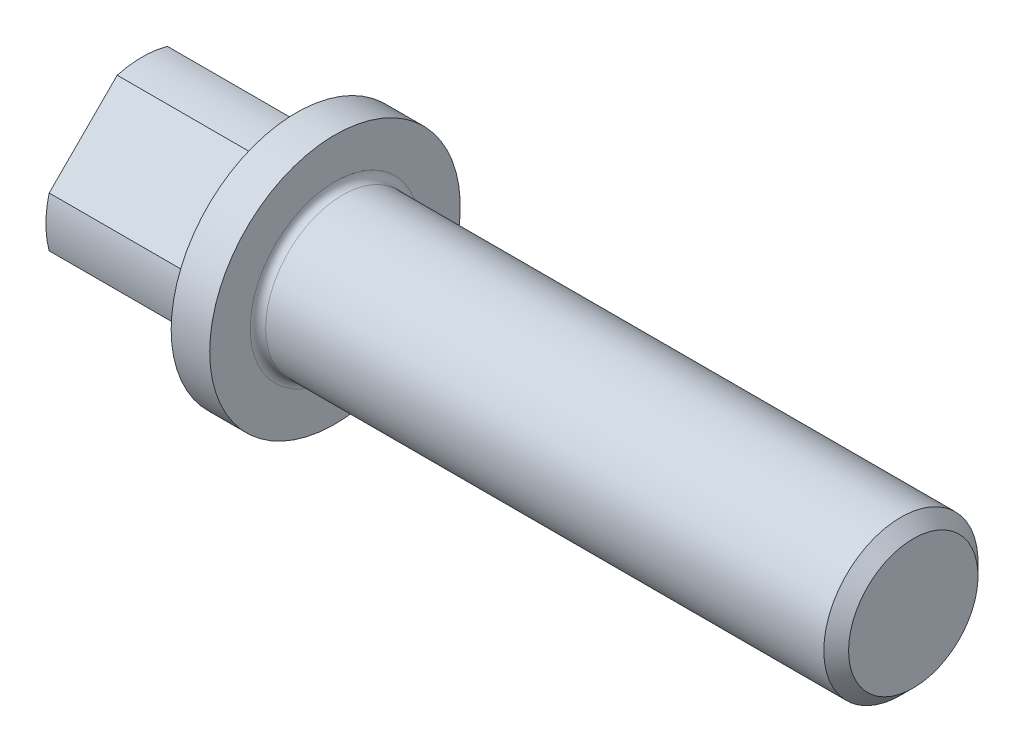
ISO-10303-21;
HEADER;
FILE_DESCRIPTION(('STEP AP214'),'2;1');
FILE_NAME('part.step','',(''),(''),'','','');
FILE_SCHEMA(('AUTOMOTIVE_DESIGN { 1 0 10303 214 1 1 1 1 }'));
ENDSEC;
DATA;
#1=APPLICATION_CONTEXT('core data for automotive mechanical design processes');
#2=APPLICATION_PROTOCOL_DEFINITION('international standard','automotive_design',2000,#1);
#3=PRODUCT_CONTEXT('',#1,'mechanical');
#4=PRODUCT('Part','Part','',(#3));
#5=PRODUCT_RELATED_PRODUCT_CATEGORY('part','',(#4));
#6=PRODUCT_DEFINITION_FORMATION('','',#4);
#7=PRODUCT_DEFINITION_CONTEXT('part definition',#1,'design');
#8=PRODUCT_DEFINITION('design','',#6,#7);
#9=PRODUCT_DEFINITION_SHAPE('','',#8);
#10=(LENGTH_UNIT() NAMED_UNIT(*) SI_UNIT(.MILLI.,.METRE.));
#11=(NAMED_UNIT(*) PLANE_ANGLE_UNIT() SI_UNIT($,.RADIAN.));
#12=(NAMED_UNIT(*) SI_UNIT($,.STERADIAN.) SOLID_ANGLE_UNIT());
#13=UNCERTAINTY_MEASURE_WITH_UNIT(LENGTH_MEASURE(1.E-05),#10,'distance_accuracy_value','');
#14=(GEOMETRIC_REPRESENTATION_CONTEXT(3) GLOBAL_UNCERTAINTY_ASSIGNED_CONTEXT((#13)) GLOBAL_UNIT_ASSIGNED_CONTEXT((#10,
#11,#12)) REPRESENTATION_CONTEXT('',''));
#15=CARTESIAN_POINT('',(0.,0.,0.));
#16=DIRECTION('',(0.,0.,1.));
#17=DIRECTION('',(1.,0.,0.));
#18=AXIS2_PLACEMENT_3D('',#15,#16,#17);
#19=CARTESIAN_POINT('',(60.,5.036,0.));
#20=DIRECTION('',(1.,0.,0.));
#21=DIRECTION('',(0.,0.,-1.));
#22=AXIS2_PLACEMENT_3D('',#19,#20,#21);
#23=PLANE('',#22);
#24=CARTESIAN_POINT('',(60.,0.,0.));
#25=DIRECTION('',(-1.,0.,0.));
#26=DIRECTION('',(0.,0.,1.));
#27=AXIS2_PLACEMENT_3D('',#24,#25,#26);
#28=CIRCLE('',#27,5.036);
#29=CARTESIAN_POINT('',(60.,0.,5.036));
#30=VERTEX_POINT('',#29);
#31=EDGE_CURVE('E170',#30,#30,#28,.T.);
#32=ORIENTED_EDGE('',*,*,#31,.F.);
#33=EDGE_LOOP('',(#32));
#34=FACE_BOUND('',#33,.T.);
#35=ADVANCED_FACE('F33',(#34),#23,.T.);
#36=CARTESIAN_POINT('',(60.,0.,0.));
#37=DIRECTION('',(-1.,0.,0.));
#38=DIRECTION('',(0.,0.,1.));
#39=AXIS2_PLACEMENT_3D('',#36,#37,#38);
#40=CONICAL_SURFACE('',#39,5.036,0.785398163397445);
#41=CARTESIAN_POINT('',(59.036,0.,0.));
#42=DIRECTION('',(-1.,0.,0.));
#43=DIRECTION('',(0.,0.,1.));
#44=AXIS2_PLACEMENT_3D('',#41,#42,#43);
#45=CIRCLE('',#44,6.);
#46=CARTESIAN_POINT('',(59.036,0.,6.));
#47=VERTEX_POINT('',#46);
#48=EDGE_CURVE('E167',#47,#47,#45,.T.);
#49=ORIENTED_EDGE('',*,*,#48,.F.);
#50=EDGE_LOOP('',(#49));
#51=FACE_BOUND('',#50,.T.);
#52=ORIENTED_EDGE('',*,*,#31,.T.);
#53=EDGE_LOOP('',(#52));
#54=FACE_BOUND('',#53,.T.);
#55=ADVANCED_FACE('F192',(#51,#54),#40,.T.);
#56=CARTESIAN_POINT('',(-31.75,0.,0.));
#57=DIRECTION('',(-1.,0.,0.));
#58=DIRECTION('',(0.,0.,1.));
#59=AXIS2_PLACEMENT_3D('',#56,#57,#58);
#60=CYLINDRICAL_SURFACE('',#59,6.);
#61=CARTESIAN_POINT('',(15.6,0.,0.));
#62=DIRECTION('',(1.,0.,0.));
#63=DIRECTION('',(0.,0.,-1.));
#64=AXIS2_PLACEMENT_3D('',#61,#62,#63);
#65=CIRCLE('',#64,6.);
#66=CARTESIAN_POINT('',(15.6,0.,-6.));
#67=VERTEX_POINT('',#66);
#68=EDGE_CURVE('E12',#67,#67,#65,.T.);
#69=ORIENTED_EDGE('',*,*,#68,.T.);
#70=EDGE_LOOP('',(#69));
#71=FACE_BOUND('',#70,.T.);
#72=ORIENTED_EDGE('',*,*,#48,.T.);
#73=EDGE_LOOP('',(#72));
#74=FACE_BOUND('',#73,.T.);
#75=ADVANCED_FACE('F197',(#71,#74),#60,.T.);
#76=CARTESIAN_POINT('',(15.,9.75,0.));
#77=DIRECTION('',(1.,0.,0.));
#78=DIRECTION('',(0.,0.,-1.));
#79=AXIS2_PLACEMENT_3D('',#76,#77,#78);
#80=PLANE('',#79);
#81=CARTESIAN_POINT('',(15.,0.,0.));
#82=DIRECTION('',(1.,0.,0.));
#83=DIRECTION('',(0.,0.,-1.));
#84=AXIS2_PLACEMENT_3D('',#81,#82,#83);
#85=CIRCLE('',#84,6.6);
#86=CARTESIAN_POINT('',(15.,0.,-6.6));
#87=VERTEX_POINT('',#86);
#88=EDGE_CURVE('E42',#87,#87,#85,.F.);
#89=ORIENTED_EDGE('',*,*,#88,.T.);
#90=EDGE_LOOP('',(#89));
#91=FACE_BOUND('',#90,.T.);
#92=CARTESIAN_POINT('',(15.,0.,0.));
#93=DIRECTION('',(-1.,0.,0.));
#94=DIRECTION('',(0.,0.,1.));
#95=AXIS2_PLACEMENT_3D('',#92,#93,#94);
#96=CIRCLE('',#95,9.75);
#97=CARTESIAN_POINT('',(15.,0.,9.75));
#98=VERTEX_POINT('',#97);
#99=EDGE_CURVE('E164',#98,#98,#96,.T.);
#100=ORIENTED_EDGE('',*,*,#99,.F.);
#101=EDGE_LOOP('',(#100));
#102=FACE_BOUND('',#101,.T.);
#103=ADVANCED_FACE('F176',(#91,#102),#80,.T.);
#104=CARTESIAN_POINT('',(-31.75,0.,0.));
#105=DIRECTION('',(-1.,0.,0.));
#106=DIRECTION('',(0.,0.,1.));
#107=AXIS2_PLACEMENT_3D('',#104,#105,#106);
#108=CYLINDRICAL_SURFACE('',#107,9.75);
#109=CARTESIAN_POINT('',(12.,0.,0.));
#110=DIRECTION('',(1.,0.,0.));
#111=DIRECTION('',(0.,0.,-1.));
#112=AXIS2_PLACEMENT_3D('',#109,#110,#111);
#113=CIRCLE('',#112,9.75);
#114=CARTESIAN_POINT('',(12.,0.,-9.75));
#115=VERTEX_POINT('',#114);
#116=EDGE_CURVE('E37',#115,#115,#113,.F.);
#117=ORIENTED_EDGE('',*,*,#116,.F.);
#118=EDGE_LOOP('',(#117));
#119=FACE_BOUND('',#118,.T.);
#120=ORIENTED_EDGE('',*,*,#99,.T.);
#121=EDGE_LOOP('',(#120));
#122=FACE_BOUND('',#121,.T.);
#123=ADVANCED_FACE('F180',(#119,#122),#108,.T.);
#124=CARTESIAN_POINT('',(15.6,0.,0.));
#125=DIRECTION('',(1.,0.,0.));
#126=DIRECTION('',(0.,0.,-1.));
#127=AXIS2_PLACEMENT_3D('',#124,#125,#126);
#128=TOROIDAL_SURFACE('',#127,6.6,0.6);
#129=ORIENTED_EDGE('',*,*,#68,.F.);
#130=EDGE_LOOP('',(#129));
#131=FACE_BOUND('',#130,.T.);
#132=ORIENTED_EDGE('',*,*,#88,.F.);
#133=EDGE_LOOP('',(#132));
#134=FACE_BOUND('',#133,.T.);
#135=ADVANCED_FACE('F35',(#131,#134),#128,.F.);
#136=CARTESIAN_POINT('',(12.,0.,0.));
#137=DIRECTION('',(1.,0.,0.));
#138=DIRECTION('',(0.,0.,-1.));
#139=AXIS2_PLACEMENT_3D('',#136,#137,#138);
#140=PLANE('',#139);
#141=ORIENTED_EDGE('',*,*,#116,.T.);
#142=EDGE_LOOP('',(#141));
#143=FACE_BOUND('',#142,.T.);
#144=DIRECTION('',(0.,-0.707106781186547,-0.707106781186547));
#145=VECTOR('',#144,1.);
#146=CARTESIAN_POINT('',(12.,-7.24194538877715,1.95044276664797));
#147=LINE('',#146,#145);
#148=CARTESIAN_POINT('',(12.,-1.95044276664797,7.24194538877715));
#149=VERTEX_POINT('',#148);
#150=CARTESIAN_POINT('',(12.,-7.24194538877715,1.95044276664797));
#151=VERTEX_POINT('',#150);
#152=EDGE_CURVE('E101',#149,#151,#147,.T.);
#153=ORIENTED_EDGE('',*,*,#152,.T.);
#154=CARTESIAN_POINT('',(12.,0.,0.));
#155=DIRECTION('',(1.,0.,0.));
#156=DIRECTION('',(0.,0.,-1.));
#157=AXIS2_PLACEMENT_3D('',#154,#155,#156);
#158=CIRCLE('',#157,7.5);
#159=CARTESIAN_POINT('',(12.,-7.24194538877715,-1.95044276664797));
#160=VERTEX_POINT('',#159);
#161=EDGE_CURVE('E121',#151,#160,#158,.T.);
#162=ORIENTED_EDGE('',*,*,#161,.T.);
#163=DIRECTION('',(0.,0.707106781186547,-0.707106781186547));
#164=VECTOR('',#163,1.);
#165=CARTESIAN_POINT('',(12.,-7.24194538877715,-1.95044276664797));
#166=LINE('',#165,#164);
#167=CARTESIAN_POINT('',(12.,-1.95044276664797,-7.24194538877715));
#168=VERTEX_POINT('',#167);
#169=EDGE_CURVE('E123',#160,#168,#166,.T.);
#170=ORIENTED_EDGE('',*,*,#169,.T.);
#171=CARTESIAN_POINT('',(12.,0.,0.));
#172=DIRECTION('',(1.,0.,0.));
#173=DIRECTION('',(0.,0.,-1.));
#174=AXIS2_PLACEMENT_3D('',#171,#172,#173);
#175=CIRCLE('',#174,7.5);
#176=CARTESIAN_POINT('',(12.,1.95044276664797,-7.24194538877715));
#177=VERTEX_POINT('',#176);
#178=EDGE_CURVE('E127',#168,#177,#175,.T.);
#179=ORIENTED_EDGE('',*,*,#178,.T.);
#180=DIRECTION('',(0.,0.707106781186548,0.707106781186547));
#181=VECTOR('',#180,1.);
#182=CARTESIAN_POINT('',(12.,1.95044276664797,-7.24194538877715));
#183=LINE('',#182,#181);
#184=CARTESIAN_POINT('',(12.,7.24194538877715,-1.95044276664797));
#185=VERTEX_POINT('',#184);
#186=EDGE_CURVE('E129',#177,#185,#183,.T.);
#187=ORIENTED_EDGE('',*,*,#186,.T.);
#188=CARTESIAN_POINT('',(12.,0.,0.));
#189=DIRECTION('',(1.,0.,0.));
#190=DIRECTION('',(0.,0.,-1.));
#191=AXIS2_PLACEMENT_3D('',#188,#189,#190);
#192=CIRCLE('',#191,7.5);
#193=CARTESIAN_POINT('',(12.,7.24194538877715,1.95044276664797));
#194=VERTEX_POINT('',#193);
#195=EDGE_CURVE('E131',#185,#194,#192,.T.);
#196=ORIENTED_EDGE('',*,*,#195,.T.);
#197=DIRECTION('',(0.,-0.707106781186547,0.707106781186548));
#198=VECTOR('',#197,1.);
#199=CARTESIAN_POINT('',(12.,1.95044276664797,7.24194538877715));
#200=LINE('',#199,#198);
#201=CARTESIAN_POINT('',(12.,1.95044276664797,7.24194538877715));
#202=VERTEX_POINT('',#201);
#203=EDGE_CURVE('E104',#194,#202,#200,.T.);
#204=ORIENTED_EDGE('',*,*,#203,.T.);
#205=CARTESIAN_POINT('',(12.,0.,0.));
#206=DIRECTION('',(1.,0.,0.));
#207=DIRECTION('',(0.,0.,-1.));
#208=AXIS2_PLACEMENT_3D('',#205,#206,#207);
#209=CIRCLE('',#208,7.5);
#210=EDGE_CURVE('E97',#202,#149,#209,.T.);
#211=ORIENTED_EDGE('',*,*,#210,.T.);
#212=EDGE_LOOP('',(#153,#162,#170,#179,#187,#196,#204,#211));
#213=FACE_BOUND('',#212,.T.);
#214=ADVANCED_FACE('F99',(#143,#213),#140,.F.);
#215=CARTESIAN_POINT('',(12.,0.,0.));
#216=DIRECTION('',(-1.,0.,0.));
#217=DIRECTION('',(0.,0.,1.));
#218=AXIS2_PLACEMENT_3D('',#215,#216,#217);
#219=CYLINDRICAL_SURFACE('',#218,7.5);
#220=CARTESIAN_POINT('',(0.,0.,0.));
#221=DIRECTION('',(1.,0.,0.));
#222=DIRECTION('',(0.,0.,-1.));
#223=AXIS2_PLACEMENT_3D('',#220,#221,#222);
#224=CIRCLE('',#223,7.5);
#225=CARTESIAN_POINT('',(0.,1.95044276664797,7.24194538877715));
#226=VERTEX_POINT('',#225);
#227=CARTESIAN_POINT('',(0.,-1.95044276664797,7.24194538877715));
#228=VERTEX_POINT('',#227);
#229=EDGE_CURVE('E113',#226,#228,#224,.T.);
#230=ORIENTED_EDGE('',*,*,#229,.T.);
#231=DIRECTION('',(-1.,0.,0.));
#232=VECTOR('',#231,1.);
#233=CARTESIAN_POINT('',(12.,-1.95044276664797,7.24194538877715));
#234=LINE('',#233,#232);
#235=EDGE_CURVE('E110',#149,#228,#234,.T.);
#236=ORIENTED_EDGE('',*,*,#235,.F.);
#237=ORIENTED_EDGE('',*,*,#210,.F.);
#238=DIRECTION('',(-1.,0.,0.));
#239=VECTOR('',#238,1.);
#240=CARTESIAN_POINT('',(12.,1.95044276664797,7.24194538877715));
#241=LINE('',#240,#239);
#242=EDGE_CURVE('E134',#202,#226,#241,.T.);
#243=ORIENTED_EDGE('',*,*,#242,.T.);
#244=EDGE_LOOP('',(#230,#236,#237,#243));
#245=FACE_BOUND('',#244,.T.);
#246=ADVANCED_FACE('F111',(#245),#219,.T.);
#247=CARTESIAN_POINT('',(12.,-7.24194538877715,1.95044276664797));
#248=DIRECTION('',(0.,0.707106781186548,-0.707106781186548));
#249=DIRECTION('',(0.,0.707106781186548,0.707106781186548));
#250=AXIS2_PLACEMENT_3D('',#247,#248,#249);
#251=PLANE('',#250);
#252=DIRECTION('',(0.,-0.707106781186547,-0.707106781186547));
#253=VECTOR('',#252,1.);
#254=CARTESIAN_POINT('',(0.,-7.24194538877715,1.95044276664797));
#255=LINE('',#254,#253);
#256=CARTESIAN_POINT('',(0.,-7.24194538877715,1.95044276664797));
#257=VERTEX_POINT('',#256);
#258=EDGE_CURVE('E136',#228,#257,#255,.T.);
#259=ORIENTED_EDGE('',*,*,#258,.T.);
#260=DIRECTION('',(-1.,0.,0.));
#261=VECTOR('',#260,1.);
#262=CARTESIAN_POINT('',(12.,-7.24194538877715,1.95044276664797));
#263=LINE('',#262,#261);
#264=EDGE_CURVE('E117',#151,#257,#263,.T.);
#265=ORIENTED_EDGE('',*,*,#264,.F.);
#266=ORIENTED_EDGE('',*,*,#152,.F.);
#267=ORIENTED_EDGE('',*,*,#235,.T.);
#268=EDGE_LOOP('',(#259,#265,#266,#267));
#269=FACE_BOUND('',#268,.T.);
#270=ADVANCED_FACE('F119',(#269),#251,.F.);
#271=CARTESIAN_POINT('',(12.,0.,0.));
#272=DIRECTION('',(-1.,0.,0.));
#273=DIRECTION('',(0.,0.,1.));
#274=AXIS2_PLACEMENT_3D('',#271,#272,#273);
#275=CYLINDRICAL_SURFACE('',#274,7.5);
#276=CARTESIAN_POINT('',(0.,0.,0.));
#277=DIRECTION('',(1.,0.,0.));
#278=DIRECTION('',(0.,0.,-1.));
#279=AXIS2_PLACEMENT_3D('',#276,#277,#278);
#280=CIRCLE('',#279,7.5);
#281=CARTESIAN_POINT('',(0.,-7.24194538877715,-1.95044276664797));
#282=VERTEX_POINT('',#281);
#283=EDGE_CURVE('E138',#257,#282,#280,.T.);
#284=ORIENTED_EDGE('',*,*,#283,.T.);
#285=DIRECTION('',(-1.,0.,0.));
#286=VECTOR('',#285,1.);
#287=CARTESIAN_POINT('',(12.,-7.24194538877715,-1.95044276664797));
#288=LINE('',#287,#286);
#289=EDGE_CURVE('E161',#160,#282,#288,.T.);
#290=ORIENTED_EDGE('',*,*,#289,.F.);
#291=ORIENTED_EDGE('',*,*,#161,.F.);
#292=ORIENTED_EDGE('',*,*,#264,.T.);
#293=EDGE_LOOP('',(#284,#290,#291,#292));
#294=FACE_BOUND('',#293,.T.);
#295=ADVANCED_FACE('F216',(#294),#275,.T.);
#296=CARTESIAN_POINT('',(12.,-7.24194538877715,-1.95044276664797));
#297=DIRECTION('',(0.,0.707106781186548,0.707106781186548));
#298=DIRECTION('',(0.,-0.707106781186548,0.707106781186548));
#299=AXIS2_PLACEMENT_3D('',#296,#297,#298);
#300=PLANE('',#299);
#301=DIRECTION('',(0.,0.707106781186547,-0.707106781186547));
#302=VECTOR('',#301,1.);
#303=CARTESIAN_POINT('',(0.,-7.24194538877715,-1.95044276664797));
#304=LINE('',#303,#302);
#305=CARTESIAN_POINT('',(0.,-1.95044276664797,-7.24194538877715));
#306=VERTEX_POINT('',#305);
#307=EDGE_CURVE('E141',#282,#306,#304,.T.);
#308=ORIENTED_EDGE('',*,*,#307,.T.);
#309=DIRECTION('',(-1.,0.,0.));
#310=VECTOR('',#309,1.);
#311=CARTESIAN_POINT('',(12.,-1.95044276664797,-7.24194538877715));
#312=LINE('',#311,#310);
#313=EDGE_CURVE('E159',#168,#306,#312,.T.);
#314=ORIENTED_EDGE('',*,*,#313,.F.);
#315=ORIENTED_EDGE('',*,*,#169,.F.);
#316=ORIENTED_EDGE('',*,*,#289,.T.);
#317=EDGE_LOOP('',(#308,#314,#315,#316));
#318=FACE_BOUND('',#317,.T.);
#319=ADVANCED_FACE('F219',(#318),#300,.F.);
#320=CARTESIAN_POINT('',(12.,0.,0.));
#321=DIRECTION('',(-1.,0.,0.));
#322=DIRECTION('',(0.,0.,1.));
#323=AXIS2_PLACEMENT_3D('',#320,#321,#322);
#324=CYLINDRICAL_SURFACE('',#323,7.5);
#325=CARTESIAN_POINT('',(0.,0.,0.));
#326=DIRECTION('',(1.,0.,0.));
#327=DIRECTION('',(0.,0.,-1.));
#328=AXIS2_PLACEMENT_3D('',#325,#326,#327);
#329=CIRCLE('',#328,7.5);
#330=CARTESIAN_POINT('',(0.,1.95044276664797,-7.24194538877715));
#331=VERTEX_POINT('',#330);
#332=EDGE_CURVE('E144',#306,#331,#329,.T.);
#333=ORIENTED_EDGE('',*,*,#332,.T.);
#334=DIRECTION('',(-1.,0.,0.));
#335=VECTOR('',#334,1.);
#336=CARTESIAN_POINT('',(12.,1.95044276664797,-7.24194538877715));
#337=LINE('',#336,#335);
#338=EDGE_CURVE('E157',#177,#331,#337,.T.);
#339=ORIENTED_EDGE('',*,*,#338,.F.);
#340=ORIENTED_EDGE('',*,*,#178,.F.);
#341=ORIENTED_EDGE('',*,*,#313,.T.);
#342=EDGE_LOOP('',(#333,#339,#340,#341));
#343=FACE_BOUND('',#342,.T.);
#344=ADVANCED_FACE('F223',(#343),#324,.T.);
#345=CARTESIAN_POINT('',(12.,1.95044276664797,-7.24194538877715));
#346=DIRECTION('',(0.,-0.707106781186547,0.707106781186548));
#347=DIRECTION('',(0.,-0.707106781186548,-0.707106781186547));
#348=AXIS2_PLACEMENT_3D('',#345,#346,#347);
#349=PLANE('',#348);
#350=DIRECTION('',(0.,0.707106781186548,0.707106781186547));
#351=VECTOR('',#350,1.);
#352=CARTESIAN_POINT('',(0.,1.95044276664797,-7.24194538877715));
#353=LINE('',#352,#351);
#354=CARTESIAN_POINT('',(0.,7.24194538877715,-1.95044276664797));
#355=VERTEX_POINT('',#354);
#356=EDGE_CURVE('E147',#331,#355,#353,.T.);
#357=ORIENTED_EDGE('',*,*,#356,.T.);
#358=DIRECTION('',(-1.,0.,0.));
#359=VECTOR('',#358,1.);
#360=CARTESIAN_POINT('',(12.,7.24194538877715,-1.95044276664797));
#361=LINE('',#360,#359);
#362=EDGE_CURVE('E155',#185,#355,#361,.T.);
#363=ORIENTED_EDGE('',*,*,#362,.F.);
#364=ORIENTED_EDGE('',*,*,#186,.F.);
#365=ORIENTED_EDGE('',*,*,#338,.T.);
#366=EDGE_LOOP('',(#357,#363,#364,#365));
#367=FACE_BOUND('',#366,.T.);
#368=ADVANCED_FACE('F227',(#367),#349,.F.);
#369=CARTESIAN_POINT('',(12.,0.,0.));
#370=DIRECTION('',(-1.,0.,0.));
#371=DIRECTION('',(0.,0.,1.));
#372=AXIS2_PLACEMENT_3D('',#369,#370,#371);
#373=CYLINDRICAL_SURFACE('',#372,7.5);
#374=CARTESIAN_POINT('',(0.,0.,0.));
#375=DIRECTION('',(1.,0.,0.));
#376=DIRECTION('',(0.,0.,-1.));
#377=AXIS2_PLACEMENT_3D('',#374,#375,#376);
#378=CIRCLE('',#377,7.5);
#379=CARTESIAN_POINT('',(0.,7.24194538877715,1.95044276664797));
#380=VERTEX_POINT('',#379);
#381=EDGE_CURVE('E49',#355,#380,#378,.T.);
#382=ORIENTED_EDGE('',*,*,#381,.T.);
#383=DIRECTION('',(-1.,0.,0.));
#384=VECTOR('',#383,1.);
#385=CARTESIAN_POINT('',(12.,7.24194538877715,1.95044276664797));
#386=LINE('',#385,#384);
#387=EDGE_CURVE('E53',#194,#380,#386,.T.);
#388=ORIENTED_EDGE('',*,*,#387,.F.);
#389=ORIENTED_EDGE('',*,*,#195,.F.);
#390=ORIENTED_EDGE('',*,*,#362,.T.);
#391=EDGE_LOOP('',(#382,#388,#389,#390));
#392=FACE_BOUND('',#391,.T.);
#393=ADVANCED_FACE('F231',(#392),#373,.T.);
#394=CARTESIAN_POINT('',(12.,1.95044276664797,7.24194538877715));
#395=DIRECTION('',(0.,-0.707106781186548,-0.707106781186547));
#396=DIRECTION('',(0.,0.707106781186547,-0.707106781186548));
#397=AXIS2_PLACEMENT_3D('',#394,#395,#396);
#398=PLANE('',#397);
#399=DIRECTION('',(0.,-0.707106781186547,0.707106781186548));
#400=VECTOR('',#399,1.);
#401=CARTESIAN_POINT('',(0.,1.95044276664797,7.24194538877715));
#402=LINE('',#401,#400);
#403=EDGE_CURVE('E107',#380,#226,#402,.T.);
#404=ORIENTED_EDGE('',*,*,#403,.T.);
#405=ORIENTED_EDGE('',*,*,#242,.F.);
#406=ORIENTED_EDGE('',*,*,#203,.F.);
#407=ORIENTED_EDGE('',*,*,#387,.T.);
#408=EDGE_LOOP('',(#404,#405,#406,#407));
#409=FACE_BOUND('',#408,.T.);
#410=ADVANCED_FACE('F209',(#409),#398,.F.);
#411=CARTESIAN_POINT('',(0.,0.,0.));
#412=DIRECTION('',(-1.,0.,0.));
#413=DIRECTION('',(0.,0.,1.));
#414=AXIS2_PLACEMENT_3D('',#411,#412,#413);
#415=PLANE('',#414);
#416=ORIENTED_EDGE('',*,*,#229,.F.);
#417=ORIENTED_EDGE('',*,*,#403,.F.);
#418=ORIENTED_EDGE('',*,*,#381,.F.);
#419=ORIENTED_EDGE('',*,*,#356,.F.);
#420=ORIENTED_EDGE('',*,*,#332,.F.);
#421=ORIENTED_EDGE('',*,*,#307,.F.);
#422=ORIENTED_EDGE('',*,*,#283,.F.);
#423=ORIENTED_EDGE('',*,*,#258,.F.);
#424=EDGE_LOOP('',(#416,#417,#418,#419,#420,#421,#422,#423));
#425=FACE_BOUND('',#424,.T.);
#426=ADVANCED_FACE('F207',(#425),#415,.T.);
#427=CLOSED_SHELL('',(#35,#55,#75,#103,#123,#135,#214,#246,#270,#295,#319,#344,#368,#393,#410,#426));
#428=MANIFOLD_SOLID_BREP('B2',#427);
#429=ADVANCED_BREP_SHAPE_REPRESENTATION('',(#18,#428),#14);
#430=SHAPE_DEFINITION_REPRESENTATION(#9,#429);
ENDSEC;
END-ISO-10303-21;
